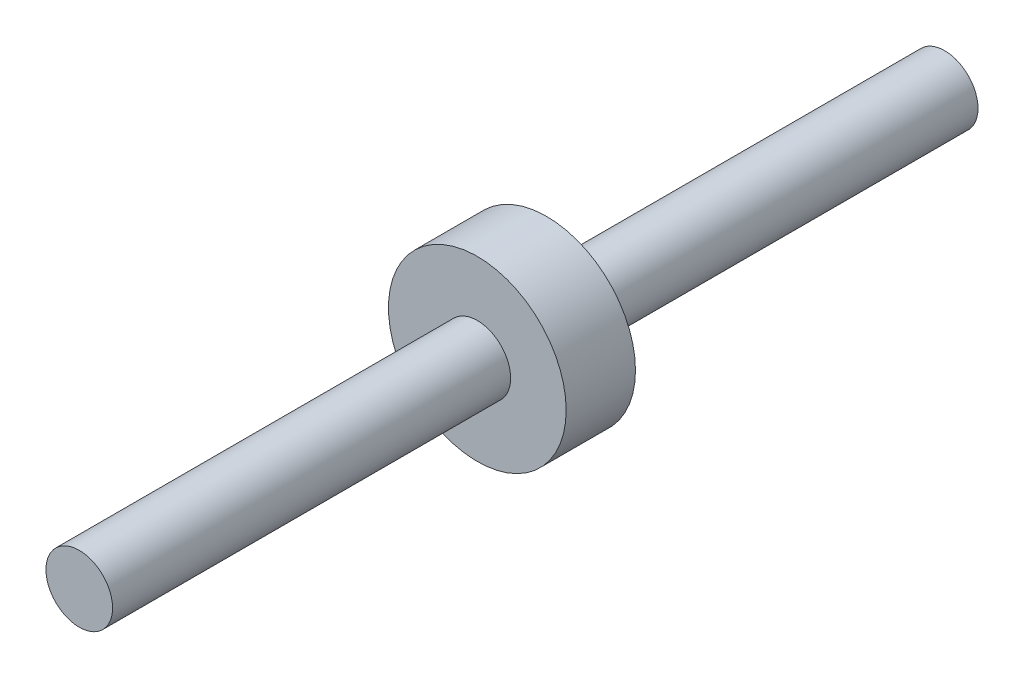
ISO-10303-21;
HEADER;
FILE_DESCRIPTION(('STEP AP214'),'2;1');
FILE_NAME('part.step','',(''),(''),'','','');
FILE_SCHEMA(('AUTOMOTIVE_DESIGN { 1 0 10303 214 1 1 1 1 }'));
ENDSEC;
DATA;
#1=APPLICATION_CONTEXT('core data for automotive mechanical design processes');
#2=APPLICATION_PROTOCOL_DEFINITION('international standard','automotive_design',2000,#1);
#3=PRODUCT_CONTEXT('',#1,'mechanical');
#4=PRODUCT('Part','Part','',(#3));
#5=PRODUCT_RELATED_PRODUCT_CATEGORY('part','',(#4));
#6=PRODUCT_DEFINITION_FORMATION('','',#4);
#7=PRODUCT_DEFINITION_CONTEXT('part definition',#1,'design');
#8=PRODUCT_DEFINITION('design','',#6,#7);
#9=PRODUCT_DEFINITION_SHAPE('','',#8);
#10=(LENGTH_UNIT() NAMED_UNIT(*) SI_UNIT(.MILLI.,.METRE.));
#11=(NAMED_UNIT(*) PLANE_ANGLE_UNIT() SI_UNIT($,.RADIAN.));
#12=(NAMED_UNIT(*) SI_UNIT($,.STERADIAN.) SOLID_ANGLE_UNIT());
#13=UNCERTAINTY_MEASURE_WITH_UNIT(LENGTH_MEASURE(1.E-05),#10,'distance_accuracy_value','');
#14=(GEOMETRIC_REPRESENTATION_CONTEXT(3) GLOBAL_UNCERTAINTY_ASSIGNED_CONTEXT((#13)) GLOBAL_UNIT_ASSIGNED_CONTEXT((#10,
#11,#12)) REPRESENTATION_CONTEXT('',''));
#15=CARTESIAN_POINT('',(0.,0.,0.));
#16=DIRECTION('',(0.,0.,1.));
#17=DIRECTION('',(1.,0.,0.));
#18=AXIS2_PLACEMENT_3D('',#15,#16,#17);
#19=CARTESIAN_POINT('',(0.,0.,123.698));
#20=DIRECTION('',(0.,0.,-1.));
#21=DIRECTION('',(-1.,0.,0.));
#22=AXIS2_PLACEMENT_3D('',#19,#20,#21);
#23=CYLINDRICAL_SURFACE('',#22,4.7625);
#24=CARTESIAN_POINT('',(0.,0.,66.802));
#25=DIRECTION('',(0.,0.,1.));
#26=DIRECTION('',(1.,0.,0.));
#27=AXIS2_PLACEMENT_3D('',#24,#25,#26);
#28=CIRCLE('',#27,4.7625);
#29=CARTESIAN_POINT('',(4.7625,0.,66.802));
#30=VERTEX_POINT('',#29);
#31=EDGE_CURVE('E33',#30,#30,#28,.T.);
#32=ORIENTED_EDGE('',*,*,#31,.T.);
#33=EDGE_LOOP('',(#32));
#34=FACE_BOUND('',#33,.T.);
#35=CARTESIAN_POINT('',(0.,0.,123.698));
#36=DIRECTION('',(0.,0.,1.));
#37=DIRECTION('',(1.,0.,0.));
#38=AXIS2_PLACEMENT_3D('',#35,#36,#37);
#39=CIRCLE('',#38,4.7625);
#40=CARTESIAN_POINT('',(4.7625,0.,123.698));
#41=VERTEX_POINT('',#40);
#42=EDGE_CURVE('E37',#41,#41,#39,.T.);
#43=ORIENTED_EDGE('',*,*,#42,.F.);
#44=EDGE_LOOP('',(#43));
#45=FACE_BOUND('',#44,.T.);
#46=ADVANCED_FACE('F30',(#34,#45),#23,.T.);
#47=CARTESIAN_POINT('',(0.,0.,123.698));
#48=DIRECTION('',(0.,0.,1.));
#49=DIRECTION('',(1.,0.,0.));
#50=AXIS2_PLACEMENT_3D('',#47,#48,#49);
#51=PLANE('',#50);
#52=ORIENTED_EDGE('',*,*,#42,.T.);
#53=EDGE_LOOP('',(#52));
#54=FACE_BOUND('',#53,.T.);
#55=ADVANCED_FACE('F69',(#54),#51,.T.);
#56=CARTESIAN_POINT('',(0.,0.,66.802));
#57=DIRECTION('',(0.,0.,-1.));
#58=DIRECTION('',(-1.,0.,0.));
#59=AXIS2_PLACEMENT_3D('',#56,#57,#58);
#60=CYLINDRICAL_SURFACE('',#59,12.7);
#61=CARTESIAN_POINT('',(0.,0.,66.802));
#62=DIRECTION('',(0.,0.,1.));
#63=DIRECTION('',(1.,0.,0.));
#64=AXIS2_PLACEMENT_3D('',#61,#62,#63);
#65=CIRCLE('',#64,12.7);
#66=CARTESIAN_POINT('',(12.7,0.,66.802));
#67=VERTEX_POINT('',#66);
#68=EDGE_CURVE('E49',#67,#67,#65,.T.);
#69=ORIENTED_EDGE('',*,*,#68,.F.);
#70=EDGE_LOOP('',(#69));
#71=FACE_BOUND('',#70,.T.);
#72=CARTESIAN_POINT('',(0.,0.,56.896));
#73=DIRECTION('',(0.,0.,1.));
#74=DIRECTION('',(1.,0.,0.));
#75=AXIS2_PLACEMENT_3D('',#72,#73,#74);
#76=CIRCLE('',#75,12.7);
#77=CARTESIAN_POINT('',(12.7,0.,56.896));
#78=VERTEX_POINT('',#77);
#79=EDGE_CURVE('E46',#78,#78,#76,.T.);
#80=ORIENTED_EDGE('',*,*,#79,.T.);
#81=EDGE_LOOP('',(#80));
#82=FACE_BOUND('',#81,.T.);
#83=ADVANCED_FACE('F61',(#71,#82),#60,.T.);
#84=CARTESIAN_POINT('',(0.,0.,66.802));
#85=DIRECTION('',(0.,0.,1.));
#86=DIRECTION('',(1.,0.,0.));
#87=AXIS2_PLACEMENT_3D('',#84,#85,#86);
#88=PLANE('',#87);
#89=ORIENTED_EDGE('',*,*,#31,.F.);
#90=EDGE_LOOP('',(#89));
#91=FACE_BOUND('',#90,.T.);
#92=ORIENTED_EDGE('',*,*,#68,.T.);
#93=EDGE_LOOP('',(#92));
#94=FACE_BOUND('',#93,.T.);
#95=ADVANCED_FACE('F58',(#91,#94),#88,.T.);
#96=CARTESIAN_POINT('',(0.,0.,56.896));
#97=DIRECTION('',(0.,0.,1.));
#98=DIRECTION('',(1.,0.,0.));
#99=AXIS2_PLACEMENT_3D('',#96,#97,#98);
#100=PLANE('',#99);
#101=CARTESIAN_POINT('',(0.,0.,56.896));
#102=DIRECTION('',(0.,0.,1.));
#103=DIRECTION('',(1.,0.,0.));
#104=AXIS2_PLACEMENT_3D('',#101,#102,#103);
#105=CIRCLE('',#104,4.7625);
#106=CARTESIAN_POINT('',(4.7625,0.,56.896));
#107=VERTEX_POINT('',#106);
#108=EDGE_CURVE('E10',#107,#107,#105,.T.);
#109=ORIENTED_EDGE('',*,*,#108,.T.);
#110=EDGE_LOOP('',(#109));
#111=FACE_BOUND('',#110,.T.);
#112=ORIENTED_EDGE('',*,*,#79,.F.);
#113=EDGE_LOOP('',(#112));
#114=FACE_BOUND('',#113,.T.);
#115=ADVANCED_FACE('F60',(#111,#114),#100,.F.);
#116=CARTESIAN_POINT('',(0.,0.,0.));
#117=DIRECTION('',(0.,0.,1.));
#118=DIRECTION('',(1.,0.,0.));
#119=AXIS2_PLACEMENT_3D('',#116,#117,#118);
#120=PLANE('',#119);
#121=CARTESIAN_POINT('',(0.,0.,0.));
#122=DIRECTION('',(0.,0.,1.));
#123=DIRECTION('',(1.,0.,0.));
#124=AXIS2_PLACEMENT_3D('',#121,#122,#123);
#125=CIRCLE('',#124,4.7625);
#126=CARTESIAN_POINT('',(4.7625,0.,0.));
#127=VERTEX_POINT('',#126);
#128=EDGE_CURVE('E41',#127,#127,#125,.T.);
#129=ORIENTED_EDGE('',*,*,#128,.F.);
#130=EDGE_LOOP('',(#129));
#131=FACE_BOUND('',#130,.T.);
#132=ADVANCED_FACE('F67',(#131),#120,.F.);
#133=ORIENTED_EDGE('',*,*,#128,.T.);
#134=EDGE_LOOP('',(#133));
#135=FACE_BOUND('',#134,.T.);
#136=ORIENTED_EDGE('',*,*,#108,.F.);
#137=EDGE_LOOP('',(#136));
#138=FACE_BOUND('',#137,.T.);
#139=ADVANCED_FACE('F73',(#135,#138),#23,.T.);
#140=CLOSED_SHELL('',(#46,#55,#83,#95,#115,#132,#139));
#141=MANIFOLD_SOLID_BREP('B2',#140);
#142=ADVANCED_BREP_SHAPE_REPRESENTATION('',(#18,#141),#14);
#143=SHAPE_DEFINITION_REPRESENTATION(#9,#142);
ENDSEC;
END-ISO-10303-21;
